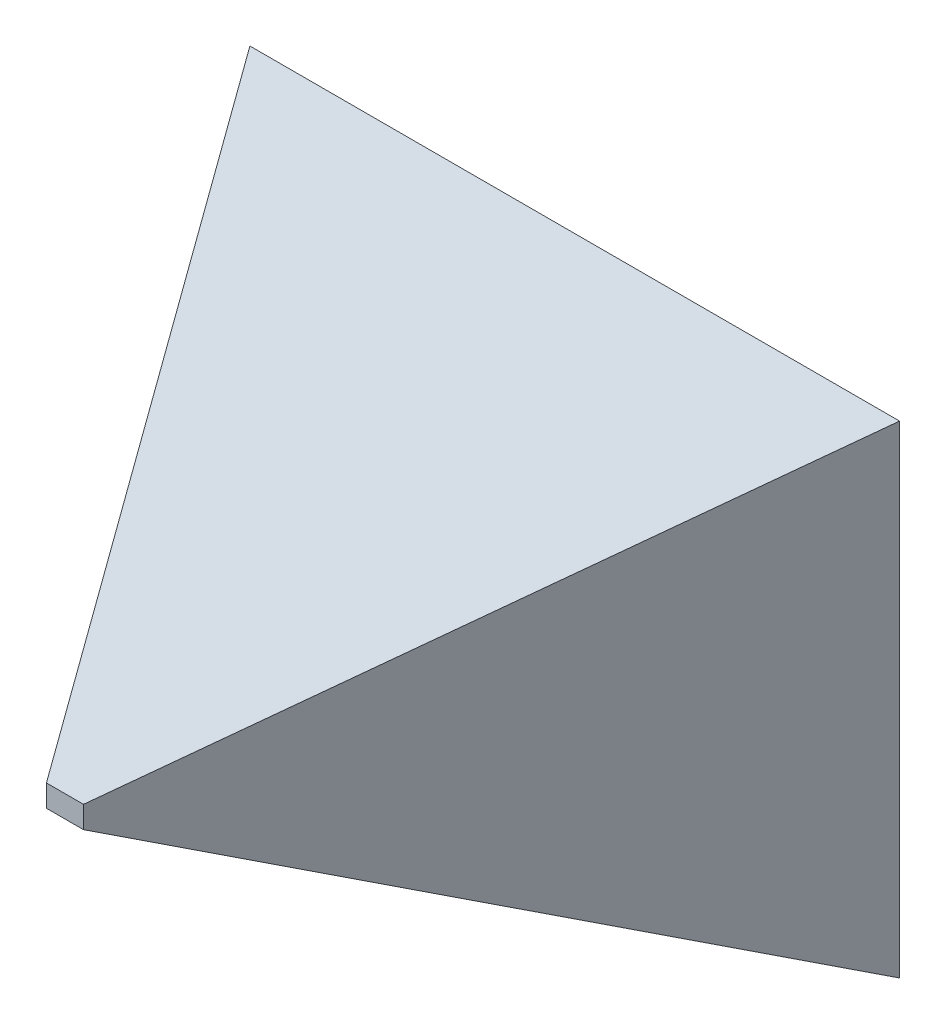
ISO-10303-21;
HEADER;
FILE_DESCRIPTION(('STEP AP214'),'2;1');
FILE_NAME('part.step','',(''),(''),'','','');
FILE_SCHEMA(('AUTOMOTIVE_DESIGN { 1 0 10303 214 1 1 1 1 }'));
ENDSEC;
DATA;
#1=APPLICATION_CONTEXT('core data for automotive mechanical design processes');
#2=APPLICATION_PROTOCOL_DEFINITION('international standard','automotive_design',2000,#1);
#3=PRODUCT_CONTEXT('',#1,'mechanical');
#4=PRODUCT('Part','Part','',(#3));
#5=PRODUCT_RELATED_PRODUCT_CATEGORY('part','',(#4));
#6=PRODUCT_DEFINITION_FORMATION('','',#4);
#7=PRODUCT_DEFINITION_CONTEXT('part definition',#1,'design');
#8=PRODUCT_DEFINITION('design','',#6,#7);
#9=PRODUCT_DEFINITION_SHAPE('','',#8);
#10=(LENGTH_UNIT() NAMED_UNIT(*) SI_UNIT(.MILLI.,.METRE.));
#11=(NAMED_UNIT(*) PLANE_ANGLE_UNIT() SI_UNIT($,.RADIAN.));
#12=(NAMED_UNIT(*) SI_UNIT($,.STERADIAN.) SOLID_ANGLE_UNIT());
#13=UNCERTAINTY_MEASURE_WITH_UNIT(LENGTH_MEASURE(1.E-05),#10,'distance_accuracy_value','');
#14=(GEOMETRIC_REPRESENTATION_CONTEXT(3) GLOBAL_UNCERTAINTY_ASSIGNED_CONTEXT((#13)) GLOBAL_UNIT_ASSIGNED_CONTEXT((#10,
#11,#12)) REPRESENTATION_CONTEXT('',''));
#15=CARTESIAN_POINT('',(0.,0.,0.));
#16=DIRECTION('',(0.,0.,1.));
#17=DIRECTION('',(1.,0.,0.));
#18=AXIS2_PLACEMENT_3D('',#15,#16,#17);
#19=CARTESIAN_POINT('',(-509.778,2349.08402996894,0.));
#20=DIRECTION('',(0.857167300702113,0.,-0.515038074910052));
#21=DIRECTION('',(-0.515038074910052,0.,-0.857167300702114));
#22=AXIS2_PLACEMENT_3D('',#19,#20,#21);
#23=PLANE('',#22);
#24=DIRECTION('',(-0.480319541328695,-0.360936599697436,-0.799385957605364));
#25=VECTOR('',#24,1.);
#26=CARTESIAN_POINT('',(112.886561054439,89.4419071291303,1036.2878533497));
#27=LINE('',#26,#25);
#28=CARTESIAN_POINT('',(-29.0895047779538,-17.2461495304158,800.));
#29=VERTEX_POINT('',#28);
#30=CARTESIAN_POINT('',(-509.778,-378.46,0.));
#31=VERTEX_POINT('',#30);
#32=EDGE_CURVE('E90',#29,#31,#27,.T.);
#33=ORIENTED_EDGE('',*,*,#32,.F.);
#34=DIRECTION('',(0.,1.,0.));
#35=VECTOR('',#34,1.);
#36=CARTESIAN_POINT('',(-29.0895047779538,0.,800.));
#37=LINE('',#36,#35);
#38=CARTESIAN_POINT('',(-29.0895047779537,17.2461495304158,800.));
#39=VERTEX_POINT('',#38);
#40=EDGE_CURVE('E48',#29,#39,#37,.T.);
#41=ORIENTED_EDGE('',*,*,#40,.T.);
#42=DIRECTION('',(0.480319541328695,-0.360936599697437,0.799385957605364));
#43=VECTOR('',#42,1.);
#44=CARTESIAN_POINT('',(-274.559434828778,201.704773960775,391.469431882393));
#45=LINE('',#44,#43);
#46=CARTESIAN_POINT('',(-509.777999999999,378.46,0.));
#47=VERTEX_POINT('',#46);
#48=EDGE_CURVE('E11',#47,#39,#45,.T.);
#49=ORIENTED_EDGE('',*,*,#48,.F.);
#50=DIRECTION('',(0.,-1.,0.));
#51=VECTOR('',#50,1.);
#52=CARTESIAN_POINT('',(-509.778,-378.46,0.));
#53=LINE('',#52,#51);
#54=EDGE_CURVE('E91',#47,#31,#53,.T.);
#55=ORIENTED_EDGE('',*,*,#54,.T.);
#56=EDGE_LOOP('',(#33,#41,#49,#55));
#57=FACE_BOUND('',#56,.T.);
#58=ADVANCED_FACE('F33',(#57),#23,.F.);
#59=CARTESIAN_POINT('',(509.778,0.,838.19598724245));
#60=DIRECTION('',(0.,0.911403276635446,-0.411514358605106));
#61=DIRECTION('',(0.,0.411514358605106,0.911403276635446));
#62=AXIS2_PLACEMENT_3D('',#59,#60,#61);
#63=PLANE('',#62);
#64=DIRECTION('',(-1.,0.,0.));
#65=VECTOR('',#64,1.);
#66=CARTESIAN_POINT('',(0.,-17.2461495304158,800.));
#67=LINE('',#66,#65);
#68=CARTESIAN_POINT('',(29.0895047779539,-17.2461495304158,800.));
#69=VERTEX_POINT('',#68);
#70=EDGE_CURVE('E103',#69,#29,#67,.T.);
#71=ORIENTED_EDGE('',*,*,#70,.T.);
#72=ORIENTED_EDGE('',*,*,#32,.T.);
#73=DIRECTION('',(1.,0.,0.));
#74=VECTOR('',#73,1.);
#75=CARTESIAN_POINT('',(509.778,-378.46,0.));
#76=LINE('',#75,#74);
#77=CARTESIAN_POINT('',(509.778,-378.46,0.));
#78=VERTEX_POINT('',#77);
#79=EDGE_CURVE('E84',#31,#78,#76,.T.);
#80=ORIENTED_EDGE('',*,*,#79,.T.);
#81=DIRECTION('',(-0.480319541328696,0.360936599697436,0.799385957605363));
#82=VECTOR('',#81,1.);
#83=CARTESIAN_POINT('',(122.332004116783,-87.3133189100947,644.818421467305));
#84=LINE('',#83,#82);
#85=EDGE_CURVE('E71',#78,#69,#84,.T.);
#86=ORIENTED_EDGE('',*,*,#85,.T.);
#87=EDGE_LOOP('',(#71,#72,#80,#86));
#88=FACE_BOUND('',#87,.T.);
#89=ADVANCED_FACE('F89',(#88),#63,.F.);
#90=CARTESIAN_POINT('',(0.,0.,800.));
#91=DIRECTION('',(0.,0.,1.));
#92=DIRECTION('',(1.,0.,0.));
#93=AXIS2_PLACEMENT_3D('',#90,#91,#92);
#94=PLANE('',#93);
#95=ORIENTED_EDGE('',*,*,#40,.F.);
#96=ORIENTED_EDGE('',*,*,#70,.F.);
#97=DIRECTION('',(0.,-1.,0.));
#98=VECTOR('',#97,1.);
#99=CARTESIAN_POINT('',(29.0895047779539,0.,800.));
#100=LINE('',#99,#98);
#101=CARTESIAN_POINT('',(29.0895047779539,17.2461495304158,800.));
#102=VERTEX_POINT('',#101);
#103=EDGE_CURVE('E74',#102,#69,#100,.T.);
#104=ORIENTED_EDGE('',*,*,#103,.F.);
#105=DIRECTION('',(1.,0.,0.));
#106=VECTOR('',#105,1.);
#107=CARTESIAN_POINT('',(0.,17.2461495304158,800.));
#108=LINE('',#107,#106);
#109=EDGE_CURVE('E93',#39,#102,#108,.T.);
#110=ORIENTED_EDGE('',*,*,#109,.F.);
#111=EDGE_LOOP('',(#95,#96,#104,#110));
#112=FACE_BOUND('',#111,.T.);
#113=ADVANCED_FACE('F102',(#112),#94,.T.);
#114=CARTESIAN_POINT('',(0.,0.,0.));
#115=DIRECTION('',(0.,0.,1.));
#116=DIRECTION('',(1.,0.,0.));
#117=AXIS2_PLACEMENT_3D('',#114,#115,#116);
#118=PLANE('',#117);
#119=ORIENTED_EDGE('',*,*,#54,.F.);
#120=DIRECTION('',(-1.,0.,0.));
#121=VECTOR('',#120,1.);
#122=CARTESIAN_POINT('',(509.778,378.46,0.));
#123=LINE('',#122,#121);
#124=CARTESIAN_POINT('',(509.778,378.46,0.));
#125=VERTEX_POINT('',#124);
#126=EDGE_CURVE('E86',#125,#47,#123,.T.);
#127=ORIENTED_EDGE('',*,*,#126,.F.);
#128=DIRECTION('',(0.,1.,0.));
#129=VECTOR('',#128,1.);
#130=CARTESIAN_POINT('',(509.778,-378.46,0.));
#131=LINE('',#130,#129);
#132=EDGE_CURVE('E55',#78,#125,#131,.T.);
#133=ORIENTED_EDGE('',*,*,#132,.F.);
#134=ORIENTED_EDGE('',*,*,#79,.F.);
#135=EDGE_LOOP('',(#119,#127,#133,#134));
#136=FACE_BOUND('',#135,.T.);
#137=ADVANCED_FACE('F35',(#136),#118,.F.);
#138=CARTESIAN_POINT('',(509.778,378.46,0.));
#139=DIRECTION('',(0.,-0.911403276635446,-0.411514358605107));
#140=DIRECTION('',(0.,0.411514358605107,-0.911403276635446));
#141=AXIS2_PLACEMENT_3D('',#138,#139,#140);
#142=PLANE('',#141);
#143=ORIENTED_EDGE('',*,*,#126,.T.);
#144=ORIENTED_EDGE('',*,*,#48,.T.);
#145=ORIENTED_EDGE('',*,*,#109,.T.);
#146=DIRECTION('',(0.480319541328696,0.360936599697436,-0.799385957605363));
#147=VECTOR('',#146,1.);
#148=CARTESIAN_POINT('',(509.778,378.46,0.));
#149=LINE('',#148,#147);
#150=EDGE_CURVE('E41',#102,#125,#149,.T.);
#151=ORIENTED_EDGE('',*,*,#150,.T.);
#152=EDGE_LOOP('',(#143,#144,#145,#151));
#153=FACE_BOUND('',#152,.T.);
#154=ADVANCED_FACE('F99',(#153),#142,.F.);
#155=CARTESIAN_POINT('',(0.,2349.08402996894,848.413065953686));
#156=DIRECTION('',(-0.857167300702113,0.,-0.515038074910052));
#157=DIRECTION('',(-0.515038074910052,0.,0.857167300702113));
#158=AXIS2_PLACEMENT_3D('',#155,#156,#157);
#159=PLANE('',#158);
#160=ORIENTED_EDGE('',*,*,#85,.F.);
#161=ORIENTED_EDGE('',*,*,#132,.T.);
#162=ORIENTED_EDGE('',*,*,#150,.F.);
#163=ORIENTED_EDGE('',*,*,#103,.T.);
#164=EDGE_LOOP('',(#160,#161,#162,#163));
#165=FACE_BOUND('',#164,.T.);
#166=ADVANCED_FACE('F72',(#165),#159,.F.);
#167=CLOSED_SHELL('',(#58,#89,#113,#137,#154,#166));
#168=MANIFOLD_SOLID_BREP('B2',#167);
#169=ADVANCED_BREP_SHAPE_REPRESENTATION('',(#18,#168),#14);
#170=SHAPE_DEFINITION_REPRESENTATION(#9,#169);
ENDSEC;
END-ISO-10303-21;
